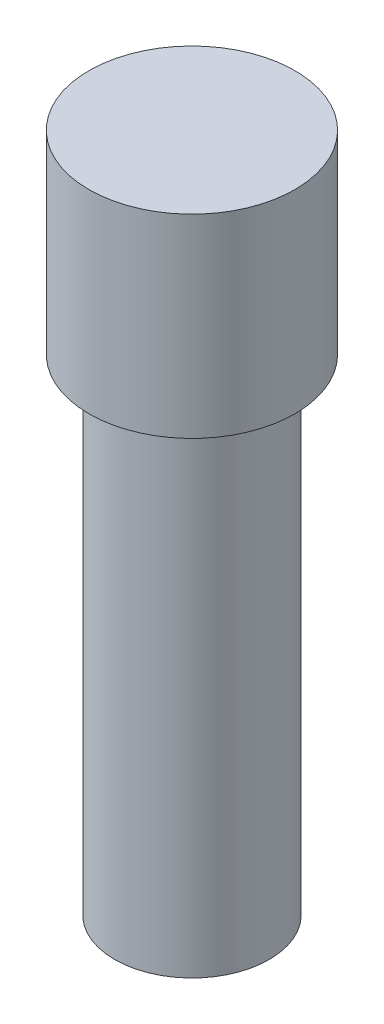
ISO-10303-21;
HEADER;
FILE_DESCRIPTION(('STEP AP214'),'2;1');
FILE_NAME('part.step','',(''),(''),'','','');
FILE_SCHEMA(('AUTOMOTIVE_DESIGN { 1 0 10303 214 1 1 1 1 }'));
ENDSEC;
DATA;
#1=APPLICATION_CONTEXT('core data for automotive mechanical design processes');
#2=APPLICATION_PROTOCOL_DEFINITION('international standard','automotive_design',2000,#1);
#3=PRODUCT_CONTEXT('',#1,'mechanical');
#4=PRODUCT('Part','Part','',(#3));
#5=PRODUCT_RELATED_PRODUCT_CATEGORY('part','',(#4));
#6=PRODUCT_DEFINITION_FORMATION('','',#4);
#7=PRODUCT_DEFINITION_CONTEXT('part definition',#1,'design');
#8=PRODUCT_DEFINITION('design','',#6,#7);
#9=PRODUCT_DEFINITION_SHAPE('','',#8);
#10=(LENGTH_UNIT() NAMED_UNIT(*) SI_UNIT(.MILLI.,.METRE.));
#11=(NAMED_UNIT(*) PLANE_ANGLE_UNIT() SI_UNIT($,.RADIAN.));
#12=(NAMED_UNIT(*) SI_UNIT($,.STERADIAN.) SOLID_ANGLE_UNIT());
#13=UNCERTAINTY_MEASURE_WITH_UNIT(LENGTH_MEASURE(1.E-05),#10,'distance_accuracy_value','');
#14=(GEOMETRIC_REPRESENTATION_CONTEXT(3) GLOBAL_UNCERTAINTY_ASSIGNED_CONTEXT((#13)) GLOBAL_UNIT_ASSIGNED_CONTEXT((#10,
#11,#12)) REPRESENTATION_CONTEXT('',''));
#15=CARTESIAN_POINT('',(0.,0.,0.));
#16=DIRECTION('',(0.,0.,1.));
#17=DIRECTION('',(1.,0.,0.));
#18=AXIS2_PLACEMENT_3D('',#15,#16,#17);
#19=CARTESIAN_POINT('',(0.,30.,0.));
#20=DIRECTION('',(0.,-1.,0.));
#21=DIRECTION('',(0.,0.,-1.));
#22=AXIS2_PLACEMENT_3D('',#19,#20,#21);
#23=CYLINDRICAL_SURFACE('',#22,4.775);
#24=CARTESIAN_POINT('',(0.,30.,0.));
#25=DIRECTION('',(0.,1.,0.));
#26=DIRECTION('',(0.,0.,1.));
#27=AXIS2_PLACEMENT_3D('',#24,#25,#26);
#28=CIRCLE('',#27,4.775);
#29=CARTESIAN_POINT('',(0.,30.,4.775));
#30=VERTEX_POINT('',#29);
#31=EDGE_CURVE('E10',#30,#30,#28,.T.);
#32=ORIENTED_EDGE('',*,*,#31,.F.);
#33=EDGE_LOOP('',(#32));
#34=FACE_BOUND('',#33,.T.);
#35=CARTESIAN_POINT('',(0.,0.,0.));
#36=DIRECTION('',(0.,1.,0.));
#37=DIRECTION('',(0.,0.,1.));
#38=AXIS2_PLACEMENT_3D('',#35,#36,#37);
#39=CIRCLE('',#38,4.775);
#40=CARTESIAN_POINT('',(0.,0.,4.775));
#41=VERTEX_POINT('',#40);
#42=EDGE_CURVE('E40',#41,#41,#39,.T.);
#43=ORIENTED_EDGE('',*,*,#42,.T.);
#44=EDGE_LOOP('',(#43));
#45=FACE_BOUND('',#44,.T.);
#46=ADVANCED_FACE('F37',(#34,#45),#23,.T.);
#47=CARTESIAN_POINT('',(0.,0.,0.));
#48=DIRECTION('',(0.,1.,0.));
#49=DIRECTION('',(0.,0.,1.));
#50=AXIS2_PLACEMENT_3D('',#47,#48,#49);
#51=PLANE('',#50);
#52=ORIENTED_EDGE('',*,*,#42,.F.);
#53=EDGE_LOOP('',(#52));
#54=FACE_BOUND('',#53,.T.);
#55=ADVANCED_FACE('F64',(#54),#51,.F.);
#56=CARTESIAN_POINT('',(0.,42.,0.));
#57=DIRECTION('',(0.,-1.,0.));
#58=DIRECTION('',(0.,0.,-1.));
#59=AXIS2_PLACEMENT_3D('',#56,#57,#58);
#60=CYLINDRICAL_SURFACE('',#59,6.365);
#61=CARTESIAN_POINT('',(0.,42.,0.));
#62=DIRECTION('',(0.,1.,0.));
#63=DIRECTION('',(0.,0.,1.));
#64=AXIS2_PLACEMENT_3D('',#61,#62,#63);
#65=CIRCLE('',#64,6.365);
#66=CARTESIAN_POINT('',(0.,42.,6.365));
#67=VERTEX_POINT('',#66);
#68=EDGE_CURVE('E49',#67,#67,#65,.T.);
#69=ORIENTED_EDGE('',*,*,#68,.F.);
#70=EDGE_LOOP('',(#69));
#71=FACE_BOUND('',#70,.T.);
#72=CARTESIAN_POINT('',(0.,30.,0.));
#73=DIRECTION('',(0.,1.,0.));
#74=DIRECTION('',(0.,0.,1.));
#75=AXIS2_PLACEMENT_3D('',#72,#73,#74);
#76=CIRCLE('',#75,6.365);
#77=CARTESIAN_POINT('',(0.,30.,6.365));
#78=VERTEX_POINT('',#77);
#79=EDGE_CURVE('E51',#78,#78,#76,.T.);
#80=ORIENTED_EDGE('',*,*,#79,.T.);
#81=EDGE_LOOP('',(#80));
#82=FACE_BOUND('',#81,.T.);
#83=ADVANCED_FACE('F61',(#71,#82),#60,.T.);
#84=CARTESIAN_POINT('',(0.,42.,0.));
#85=DIRECTION('',(0.,1.,0.));
#86=DIRECTION('',(0.,0.,1.));
#87=AXIS2_PLACEMENT_3D('',#84,#85,#86);
#88=PLANE('',#87);
#89=ORIENTED_EDGE('',*,*,#68,.T.);
#90=EDGE_LOOP('',(#89));
#91=FACE_BOUND('',#90,.T.);
#92=ADVANCED_FACE('F59',(#91),#88,.T.);
#93=CARTESIAN_POINT('',(0.,30.,0.));
#94=DIRECTION('',(0.,1.,0.));
#95=DIRECTION('',(0.,0.,1.));
#96=AXIS2_PLACEMENT_3D('',#93,#94,#95);
#97=PLANE('',#96);
#98=ORIENTED_EDGE('',*,*,#31,.T.);
#99=EDGE_LOOP('',(#98));
#100=FACE_BOUND('',#99,.T.);
#101=ORIENTED_EDGE('',*,*,#79,.F.);
#102=EDGE_LOOP('',(#101));
#103=FACE_BOUND('',#102,.T.);
#104=ADVANCED_FACE('F68',(#100,#103),#97,.F.);
#105=CLOSED_SHELL('',(#46,#55,#83,#92,#104));
#106=MANIFOLD_SOLID_BREP('B2',#105);
#107=ADVANCED_BREP_SHAPE_REPRESENTATION('',(#18,#106),#14);
#108=SHAPE_DEFINITION_REPRESENTATION(#9,#107);
ENDSEC;
END-ISO-10303-21;
